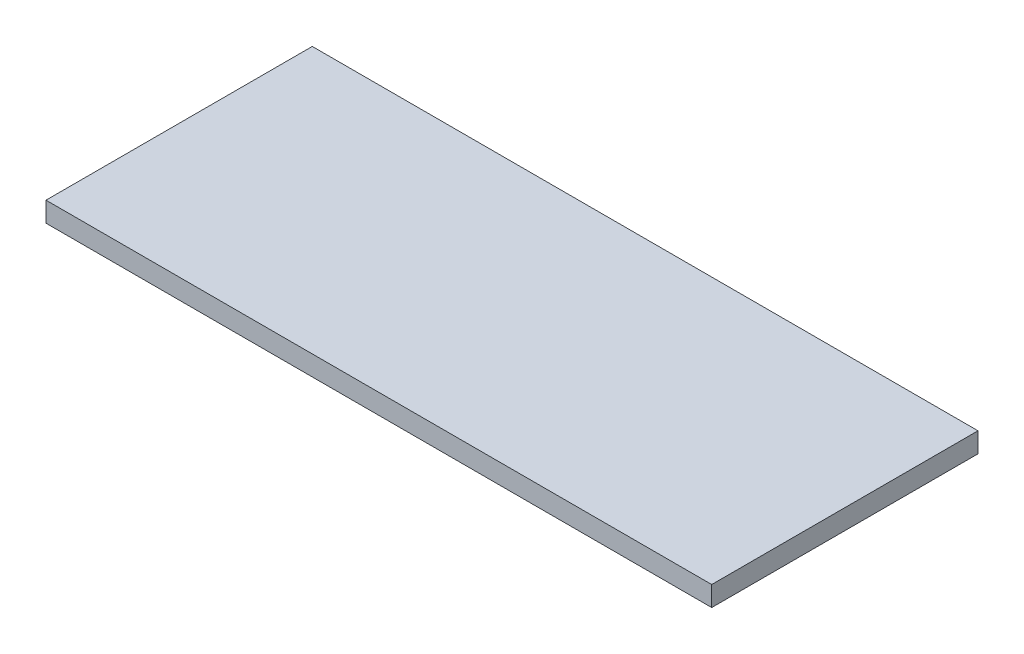
ISO-10303-21;
HEADER;
FILE_DESCRIPTION(('STEP AP214'),'2;1');
FILE_NAME('part.step','',(''),(''),'','','');
FILE_SCHEMA(('AUTOMOTIVE_DESIGN { 1 0 10303 214 1 1 1 1 }'));
ENDSEC;
DATA;
#1=APPLICATION_CONTEXT('core data for automotive mechanical design processes');
#2=APPLICATION_PROTOCOL_DEFINITION('international standard','automotive_design',2000,#1);
#3=PRODUCT_CONTEXT('',#1,'mechanical');
#4=PRODUCT('Part','Part','',(#3));
#5=PRODUCT_RELATED_PRODUCT_CATEGORY('part','',(#4));
#6=PRODUCT_DEFINITION_FORMATION('','',#4);
#7=PRODUCT_DEFINITION_CONTEXT('part definition',#1,'design');
#8=PRODUCT_DEFINITION('design','',#6,#7);
#9=PRODUCT_DEFINITION_SHAPE('','',#8);
#10=(LENGTH_UNIT() NAMED_UNIT(*) SI_UNIT(.MILLI.,.METRE.));
#11=(NAMED_UNIT(*) PLANE_ANGLE_UNIT() SI_UNIT($,.RADIAN.));
#12=(NAMED_UNIT(*) SI_UNIT($,.STERADIAN.) SOLID_ANGLE_UNIT());
#13=UNCERTAINTY_MEASURE_WITH_UNIT(LENGTH_MEASURE(1.E-05),#10,'distance_accuracy_value','');
#14=(GEOMETRIC_REPRESENTATION_CONTEXT(3) GLOBAL_UNCERTAINTY_ASSIGNED_CONTEXT((#13)) GLOBAL_UNIT_ASSIGNED_CONTEXT((#10,
#11,#12)) REPRESENTATION_CONTEXT('',''));
#15=CARTESIAN_POINT('',(0.,0.,0.));
#16=DIRECTION('',(0.,0.,1.));
#17=DIRECTION('',(1.,0.,0.));
#18=AXIS2_PLACEMENT_3D('',#15,#16,#17);
#19=CARTESIAN_POINT('',(-250.,-15.,-100.));
#20=DIRECTION('',(-1.,0.,0.));
#21=DIRECTION('',(0.,0.,1.));
#22=AXIS2_PLACEMENT_3D('',#19,#20,#21);
#23=PLANE('',#22);
#24=DIRECTION('',(0.,0.,1.));
#25=VECTOR('',#24,1.);
#26=CARTESIAN_POINT('',(-250.,0.,-100.));
#27=LINE('',#26,#25);
#28=CARTESIAN_POINT('',(-250.,0.,-100.));
#29=VERTEX_POINT('',#28);
#30=CARTESIAN_POINT('',(-250.,0.,100.));
#31=VERTEX_POINT('',#30);
#32=EDGE_CURVE('E95',#29,#31,#27,.T.);
#33=ORIENTED_EDGE('',*,*,#32,.F.);
#34=DIRECTION('',(0.,1.,0.));
#35=VECTOR('',#34,1.);
#36=CARTESIAN_POINT('',(-250.,-15.,-100.));
#37=LINE('',#36,#35);
#38=CARTESIAN_POINT('',(-250.,-15.,-100.));
#39=VERTEX_POINT('',#38);
#40=EDGE_CURVE('E11',#39,#29,#37,.T.);
#41=ORIENTED_EDGE('',*,*,#40,.F.);
#42=DIRECTION('',(0.,0.,1.));
#43=VECTOR('',#42,1.);
#44=CARTESIAN_POINT('',(-250.,-15.,-100.));
#45=LINE('',#44,#43);
#46=CARTESIAN_POINT('',(-250.,-15.,100.));
#47=VERTEX_POINT('',#46);
#48=EDGE_CURVE('E89',#39,#47,#45,.T.);
#49=ORIENTED_EDGE('',*,*,#48,.T.);
#50=DIRECTION('',(0.,1.,0.));
#51=VECTOR('',#50,1.);
#52=CARTESIAN_POINT('',(-250.,-15.,100.));
#53=LINE('',#52,#51);
#54=EDGE_CURVE('E34',#47,#31,#53,.T.);
#55=ORIENTED_EDGE('',*,*,#54,.T.);
#56=EDGE_LOOP('',(#33,#41,#49,#55));
#57=FACE_BOUND('',#56,.T.);
#58=ADVANCED_FACE('F31',(#57),#23,.T.);
#59=CARTESIAN_POINT('',(-250.,-15.,-100.));
#60=DIRECTION('',(0.,0.,-1.));
#61=DIRECTION('',(-1.,0.,0.));
#62=AXIS2_PLACEMENT_3D('',#59,#60,#61);
#63=PLANE('',#62);
#64=DIRECTION('',(-1.,0.,0.));
#65=VECTOR('',#64,1.);
#66=CARTESIAN_POINT('',(-250.,0.,-100.));
#67=LINE('',#66,#65);
#68=CARTESIAN_POINT('',(250.,0.,-100.));
#69=VERTEX_POINT('',#68);
#70=EDGE_CURVE('E91',#69,#29,#67,.T.);
#71=ORIENTED_EDGE('',*,*,#70,.F.);
#72=DIRECTION('',(0.,1.,0.));
#73=VECTOR('',#72,1.);
#74=CARTESIAN_POINT('',(250.,-15.,-100.));
#75=LINE('',#74,#73);
#76=CARTESIAN_POINT('',(250.,-15.,-100.));
#77=VERTEX_POINT('',#76);
#78=EDGE_CURVE('E40',#77,#69,#75,.T.);
#79=ORIENTED_EDGE('',*,*,#78,.F.);
#80=DIRECTION('',(-1.,0.,0.));
#81=VECTOR('',#80,1.);
#82=CARTESIAN_POINT('',(-250.,-15.,-100.));
#83=LINE('',#82,#81);
#84=EDGE_CURVE('E86',#77,#39,#83,.T.);
#85=ORIENTED_EDGE('',*,*,#84,.T.);
#86=ORIENTED_EDGE('',*,*,#40,.T.);
#87=EDGE_LOOP('',(#71,#79,#85,#86));
#88=FACE_BOUND('',#87,.T.);
#89=ADVANCED_FACE('F105',(#88),#63,.T.);
#90=CARTESIAN_POINT('',(250.,-15.,-100.));
#91=DIRECTION('',(1.,0.,0.));
#92=DIRECTION('',(0.,0.,-1.));
#93=AXIS2_PLACEMENT_3D('',#90,#91,#92);
#94=PLANE('',#93);
#95=DIRECTION('',(0.,0.,-1.));
#96=VECTOR('',#95,1.);
#97=CARTESIAN_POINT('',(250.,0.,-100.));
#98=LINE('',#97,#96);
#99=CARTESIAN_POINT('',(250.,0.,100.));
#100=VERTEX_POINT('',#99);
#101=EDGE_CURVE('E81',#100,#69,#98,.T.);
#102=ORIENTED_EDGE('',*,*,#101,.F.);
#103=DIRECTION('',(0.,1.,0.));
#104=VECTOR('',#103,1.);
#105=CARTESIAN_POINT('',(250.,-15.,100.));
#106=LINE('',#105,#104);
#107=CARTESIAN_POINT('',(250.,-15.,100.));
#108=VERTEX_POINT('',#107);
#109=EDGE_CURVE('E76',#108,#100,#106,.T.);
#110=ORIENTED_EDGE('',*,*,#109,.F.);
#111=DIRECTION('',(0.,0.,-1.));
#112=VECTOR('',#111,1.);
#113=CARTESIAN_POINT('',(250.,-15.,-100.));
#114=LINE('',#113,#112);
#115=EDGE_CURVE('E79',#108,#77,#114,.T.);
#116=ORIENTED_EDGE('',*,*,#115,.T.);
#117=ORIENTED_EDGE('',*,*,#78,.T.);
#118=EDGE_LOOP('',(#102,#110,#116,#117));
#119=FACE_BOUND('',#118,.T.);
#120=ADVANCED_FACE('F78',(#119),#94,.T.);
#121=CARTESIAN_POINT('',(-250.,-15.,100.));
#122=DIRECTION('',(0.,0.,1.));
#123=DIRECTION('',(1.,0.,0.));
#124=AXIS2_PLACEMENT_3D('',#121,#122,#123);
#125=PLANE('',#124);
#126=DIRECTION('',(1.,0.,0.));
#127=VECTOR('',#126,1.);
#128=CARTESIAN_POINT('',(-250.,0.,100.));
#129=LINE('',#128,#127);
#130=EDGE_CURVE('E98',#31,#100,#129,.T.);
#131=ORIENTED_EDGE('',*,*,#130,.F.);
#132=ORIENTED_EDGE('',*,*,#54,.F.);
#133=DIRECTION('',(1.,0.,0.));
#134=VECTOR('',#133,1.);
#135=CARTESIAN_POINT('',(-250.,-15.,100.));
#136=LINE('',#135,#134);
#137=EDGE_CURVE('E85',#47,#108,#136,.T.);
#138=ORIENTED_EDGE('',*,*,#137,.T.);
#139=ORIENTED_EDGE('',*,*,#109,.T.);
#140=EDGE_LOOP('',(#131,#132,#138,#139));
#141=FACE_BOUND('',#140,.T.);
#142=ADVANCED_FACE('F88',(#141),#125,.T.);
#143=CARTESIAN_POINT('',(-250.,-15.,100.));
#144=DIRECTION('',(0.,1.,0.));
#145=DIRECTION('',(0.,0.,1.));
#146=AXIS2_PLACEMENT_3D('',#143,#144,#145);
#147=PLANE('',#146);
#148=ORIENTED_EDGE('',*,*,#48,.F.);
#149=ORIENTED_EDGE('',*,*,#84,.F.);
#150=ORIENTED_EDGE('',*,*,#115,.F.);
#151=ORIENTED_EDGE('',*,*,#137,.F.);
#152=EDGE_LOOP('',(#148,#149,#150,#151));
#153=FACE_BOUND('',#152,.T.);
#154=ADVANCED_FACE('F84',(#153),#147,.F.);
#155=CARTESIAN_POINT('',(-250.,0.,100.));
#156=DIRECTION('',(0.,1.,0.));
#157=DIRECTION('',(0.,0.,1.));
#158=AXIS2_PLACEMENT_3D('',#155,#156,#157);
#159=PLANE('',#158);
#160=ORIENTED_EDGE('',*,*,#32,.T.);
#161=ORIENTED_EDGE('',*,*,#130,.T.);
#162=ORIENTED_EDGE('',*,*,#101,.T.);
#163=ORIENTED_EDGE('',*,*,#70,.T.);
#164=EDGE_LOOP('',(#160,#161,#162,#163));
#165=FACE_BOUND('',#164,.T.);
#166=ADVANCED_FACE('F104',(#165),#159,.T.);
#167=CLOSED_SHELL('',(#58,#89,#120,#142,#154,#166));
#168=MANIFOLD_SOLID_BREP('B2',#167);
#169=ADVANCED_BREP_SHAPE_REPRESENTATION('',(#18,#168),#14);
#170=SHAPE_DEFINITION_REPRESENTATION(#9,#169);
ENDSEC;
END-ISO-10303-21;
